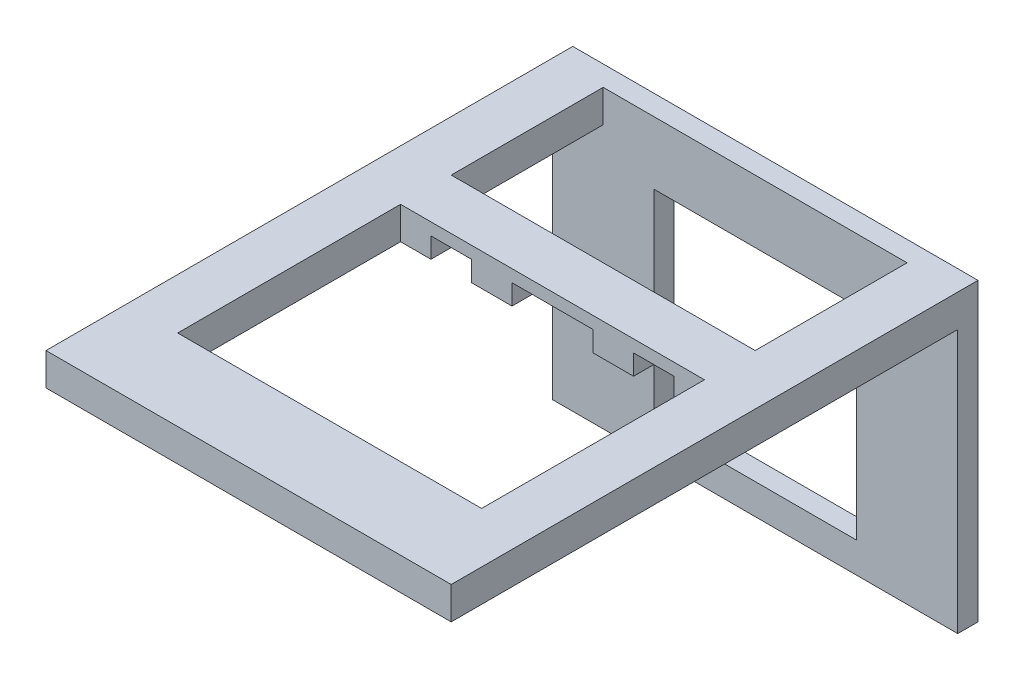
ISO-10303-21;
HEADER;
FILE_DESCRIPTION(('STEP AP214'),'2;1');
FILE_NAME('part.step','',(''),(''),'','','');
FILE_SCHEMA(('AUTOMOTIVE_DESIGN { 1 0 10303 214 1 1 1 1 }'));
ENDSEC;
DATA;
#1=APPLICATION_CONTEXT('core data for automotive mechanical design processes');
#2=APPLICATION_PROTOCOL_DEFINITION('international standard','automotive_design',2000,#1);
#3=PRODUCT_CONTEXT('',#1,'mechanical');
#4=PRODUCT('Part','Part','',(#3));
#5=PRODUCT_RELATED_PRODUCT_CATEGORY('part','',(#4));
#6=PRODUCT_DEFINITION_FORMATION('','',#4);
#7=PRODUCT_DEFINITION_CONTEXT('part definition',#1,'design');
#8=PRODUCT_DEFINITION('design','',#6,#7);
#9=PRODUCT_DEFINITION_SHAPE('','',#8);
#10=(LENGTH_UNIT() NAMED_UNIT(*) SI_UNIT(.MILLI.,.METRE.));
#11=(NAMED_UNIT(*) PLANE_ANGLE_UNIT() SI_UNIT($,.RADIAN.));
#12=(NAMED_UNIT(*) SI_UNIT($,.STERADIAN.) SOLID_ANGLE_UNIT());
#13=UNCERTAINTY_MEASURE_WITH_UNIT(LENGTH_MEASURE(1.E-05),#10,'distance_accuracy_value','');
#14=(GEOMETRIC_REPRESENTATION_CONTEXT(3) GLOBAL_UNCERTAINTY_ASSIGNED_CONTEXT((#13)) GLOBAL_UNIT_ASSIGNED_CONTEXT((#10,
#11,#12)) REPRESENTATION_CONTEXT('',''));
#15=CARTESIAN_POINT('',(0.,0.,0.));
#16=DIRECTION('',(0.,0.,1.));
#17=DIRECTION('',(1.,0.,0.));
#18=AXIS2_PLACEMENT_3D('',#15,#16,#17);
#19=CARTESIAN_POINT('',(0.,10.702908894462,11.));
#20=DIRECTION('',(0.,0.,1.));
#21=DIRECTION('',(1.,0.,0.));
#22=AXIS2_PLACEMENT_3D('',#19,#20,#21);
#23=PLANE('',#22);
#24=DIRECTION('',(-1.,0.,0.));
#25=VECTOR('',#24,1.);
#26=CARTESIAN_POINT('',(-6.,10.102908894462,11.));
#27=LINE('',#26,#25);
#28=CARTESIAN_POINT('',(-4.,10.102908894462,11.));
#29=VERTEX_POINT('',#28);
#30=CARTESIAN_POINT('',(-6.,10.102908894462,11.));
#31=VERTEX_POINT('',#30);
#32=EDGE_CURVE('E400',#29,#31,#27,.T.);
#33=ORIENTED_EDGE('',*,*,#32,.F.);
#34=DIRECTION('',(0.,1.,0.));
#35=VECTOR('',#34,1.);
#36=CARTESIAN_POINT('',(-4.,10.102908894462,11.));
#37=LINE('',#36,#35);
#38=CARTESIAN_POINT('',(-4.,9.10290889446199,11.));
#39=VERTEX_POINT('',#38);
#40=EDGE_CURVE('E819',#39,#29,#37,.T.);
#41=ORIENTED_EDGE('',*,*,#40,.F.);
#42=DIRECTION('',(-1.,0.,0.));
#43=VECTOR('',#42,1.);
#44=CARTESIAN_POINT('',(0.,9.10290889446198,11.));
#45=LINE('',#44,#43);
#46=CARTESIAN_POINT('',(-2.,9.10290889446198,11.));
#47=VERTEX_POINT('',#46);
#48=EDGE_CURVE('E256',#47,#39,#45,.T.);
#49=ORIENTED_EDGE('',*,*,#48,.F.);
#50=DIRECTION('',(0.,-1.,0.));
#51=VECTOR('',#50,1.);
#52=CARTESIAN_POINT('',(-2.,10.102908894462,11.));
#53=LINE('',#52,#51);
#54=CARTESIAN_POINT('',(-2.,10.102908894462,11.));
#55=VERTEX_POINT('',#54);
#56=EDGE_CURVE('E64',#55,#47,#53,.T.);
#57=ORIENTED_EDGE('',*,*,#56,.F.);
#58=DIRECTION('',(-1.,0.,0.));
#59=VECTOR('',#58,1.);
#60=CARTESIAN_POINT('',(-2.,10.102908894462,11.));
#61=LINE('',#60,#59);
#62=CARTESIAN_POINT('',(2.,10.102908894462,11.));
#63=VERTEX_POINT('',#62);
#64=EDGE_CURVE('E417',#63,#55,#61,.T.);
#65=ORIENTED_EDGE('',*,*,#64,.F.);
#66=DIRECTION('',(0.,1.,0.));
#67=VECTOR('',#66,1.);
#68=CARTESIAN_POINT('',(2.,10.102908894462,11.));
#69=LINE('',#68,#67);
#70=CARTESIAN_POINT('',(2.,9.10290889446199,11.));
#71=VERTEX_POINT('',#70);
#72=EDGE_CURVE('E445',#71,#63,#69,.T.);
#73=ORIENTED_EDGE('',*,*,#72,.F.);
#74=CARTESIAN_POINT('',(4.,9.10290889446198,11.));
#75=VERTEX_POINT('',#74);
#76=EDGE_CURVE('E281',#75,#71,#45,.T.);
#77=ORIENTED_EDGE('',*,*,#76,.F.);
#78=DIRECTION('',(0.,-1.,0.));
#79=VECTOR('',#78,1.);
#80=CARTESIAN_POINT('',(4.,10.102908894462,11.));
#81=LINE('',#80,#79);
#82=CARTESIAN_POINT('',(4.,10.102908894462,11.));
#83=VERTEX_POINT('',#82);
#84=EDGE_CURVE('E423',#83,#75,#81,.T.);
#85=ORIENTED_EDGE('',*,*,#84,.F.);
#86=DIRECTION('',(-1.,0.,0.));
#87=VECTOR('',#86,1.);
#88=CARTESIAN_POINT('',(4.,10.102908894462,11.));
#89=LINE('',#88,#87);
#90=CARTESIAN_POINT('',(6.,10.102908894462,11.));
#91=VERTEX_POINT('',#90);
#92=EDGE_CURVE('E248',#91,#83,#89,.T.);
#93=ORIENTED_EDGE('',*,*,#92,.F.);
#94=DIRECTION('',(0.,1.,0.));
#95=VECTOR('',#94,1.);
#96=CARTESIAN_POINT('',(6.,10.102908894462,11.));
#97=LINE('',#96,#95);
#98=CARTESIAN_POINT('',(6.,9.10290889446199,11.));
#99=VERTEX_POINT('',#98);
#100=EDGE_CURVE('E420',#99,#91,#97,.T.);
#101=ORIENTED_EDGE('',*,*,#100,.F.);
#102=CARTESIAN_POINT('',(7.5,9.10290889446199,11.));
#103=VERTEX_POINT('',#102);
#104=EDGE_CURVE('E277',#103,#99,#45,.T.);
#105=ORIENTED_EDGE('',*,*,#104,.F.);
#106=DIRECTION('',(0.,-1.,0.));
#107=VECTOR('',#106,1.);
#108=CARTESIAN_POINT('',(7.5,10.702908894462,11.));
#109=LINE('',#108,#107);
#110=CARTESIAN_POINT('',(7.5,10.702908894462,11.));
#111=VERTEX_POINT('',#110);
#112=EDGE_CURVE('E309',#111,#103,#109,.T.);
#113=ORIENTED_EDGE('',*,*,#112,.F.);
#114=DIRECTION('',(-1.,0.,0.));
#115=VECTOR('',#114,1.);
#116=CARTESIAN_POINT('',(0.,10.702908894462,11.));
#117=LINE('',#116,#115);
#118=CARTESIAN_POINT('',(-7.5,10.702908894462,11.));
#119=VERTEX_POINT('',#118);
#120=EDGE_CURVE('E475',#111,#119,#117,.T.);
#121=ORIENTED_EDGE('',*,*,#120,.T.);
#122=DIRECTION('',(0.,-1.,0.));
#123=VECTOR('',#122,1.);
#124=CARTESIAN_POINT('',(-7.5,10.702908894462,11.));
#125=LINE('',#124,#123);
#126=CARTESIAN_POINT('',(-7.5,9.10290889446198,11.));
#127=VERTEX_POINT('',#126);
#128=EDGE_CURVE('E299',#119,#127,#125,.T.);
#129=ORIENTED_EDGE('',*,*,#128,.T.);
#130=CARTESIAN_POINT('',(-6.,9.10290889446198,11.));
#131=VERTEX_POINT('',#130);
#132=EDGE_CURVE('E276',#131,#127,#45,.T.);
#133=ORIENTED_EDGE('',*,*,#132,.F.);
#134=DIRECTION('',(0.,-1.,0.));
#135=VECTOR('',#134,1.);
#136=CARTESIAN_POINT('',(-6.,10.102908894462,11.));
#137=LINE('',#136,#135);
#138=EDGE_CURVE('E56',#31,#131,#137,.T.);
#139=ORIENTED_EDGE('',*,*,#138,.F.);
#140=EDGE_LOOP('',(#33,#41,#49,#57,#65,#73,#77,#85,#93,#101,#105,#113,#121,#129,#133,#139));
#141=FACE_BOUND('',#140,.T.);
#142=ADVANCED_FACE('F39',(#141),#23,.T.);
#143=CARTESIAN_POINT('',(0.,10.702908894462,8.5));
#144=DIRECTION('',(0.,0.,1.));
#145=DIRECTION('',(1.,0.,0.));
#146=AXIS2_PLACEMENT_3D('',#143,#144,#145);
#147=PLANE('',#146);
#148=DIRECTION('',(0.,1.,0.));
#149=VECTOR('',#148,1.);
#150=CARTESIAN_POINT('',(-4.,10.102908894462,8.5));
#151=LINE('',#150,#149);
#152=CARTESIAN_POINT('',(-4.,9.10290889446198,8.5));
#153=VERTEX_POINT('',#152);
#154=CARTESIAN_POINT('',(-4.,10.102908894462,8.5));
#155=VERTEX_POINT('',#154);
#156=EDGE_CURVE('E237',#153,#155,#151,.T.);
#157=ORIENTED_EDGE('',*,*,#156,.T.);
#158=DIRECTION('',(-1.,0.,0.));
#159=VECTOR('',#158,1.);
#160=CARTESIAN_POINT('',(-6.,10.102908894462,8.5));
#161=LINE('',#160,#159);
#162=CARTESIAN_POINT('',(-6.,10.102908894462,8.5));
#163=VERTEX_POINT('',#162);
#164=EDGE_CURVE('E405',#155,#163,#161,.T.);
#165=ORIENTED_EDGE('',*,*,#164,.T.);
#166=DIRECTION('',(0.,-1.,0.));
#167=VECTOR('',#166,1.);
#168=CARTESIAN_POINT('',(-6.,10.102908894462,8.5));
#169=LINE('',#168,#167);
#170=CARTESIAN_POINT('',(-6.,9.10290889446198,8.5));
#171=VERTEX_POINT('',#170);
#172=EDGE_CURVE('E247',#163,#171,#169,.T.);
#173=ORIENTED_EDGE('',*,*,#172,.T.);
#174=DIRECTION('',(-1.,0.,0.));
#175=VECTOR('',#174,1.);
#176=CARTESIAN_POINT('',(0.,9.10290889446198,8.5));
#177=LINE('',#176,#175);
#178=CARTESIAN_POINT('',(-7.5,9.10290889446198,8.5));
#179=VERTEX_POINT('',#178);
#180=EDGE_CURVE('E264',#171,#179,#177,.T.);
#181=ORIENTED_EDGE('',*,*,#180,.T.);
#182=DIRECTION('',(0.,-1.,0.));
#183=VECTOR('',#182,1.);
#184=CARTESIAN_POINT('',(-7.5,10.702908894462,8.5));
#185=LINE('',#184,#183);
#186=CARTESIAN_POINT('',(-7.5,10.702908894462,8.5));
#187=VERTEX_POINT('',#186);
#188=EDGE_CURVE('E313',#187,#179,#185,.T.);
#189=ORIENTED_EDGE('',*,*,#188,.F.);
#190=DIRECTION('',(-1.,0.,0.));
#191=VECTOR('',#190,1.);
#192=CARTESIAN_POINT('',(0.,10.702908894462,8.5));
#193=LINE('',#192,#191);
#194=CARTESIAN_POINT('',(7.5,10.702908894462,8.5));
#195=VERTEX_POINT('',#194);
#196=EDGE_CURVE('E470',#195,#187,#193,.T.);
#197=ORIENTED_EDGE('',*,*,#196,.F.);
#198=DIRECTION('',(0.,-1.,0.));
#199=VECTOR('',#198,1.);
#200=CARTESIAN_POINT('',(7.5,10.702908894462,8.5));
#201=LINE('',#200,#199);
#202=CARTESIAN_POINT('',(7.5,9.10290889446199,8.5));
#203=VERTEX_POINT('',#202);
#204=EDGE_CURVE('E316',#195,#203,#201,.T.);
#205=ORIENTED_EDGE('',*,*,#204,.T.);
#206=CARTESIAN_POINT('',(6.,9.10290889446199,8.5));
#207=VERTEX_POINT('',#206);
#208=EDGE_CURVE('E267',#203,#207,#177,.T.);
#209=ORIENTED_EDGE('',*,*,#208,.T.);
#210=DIRECTION('',(0.,1.,0.));
#211=VECTOR('',#210,1.);
#212=CARTESIAN_POINT('',(6.,10.102908894462,8.5));
#213=LINE('',#212,#211);
#214=CARTESIAN_POINT('',(6.,10.102908894462,8.5));
#215=VERTEX_POINT('',#214);
#216=EDGE_CURVE('E413',#207,#215,#213,.T.);
#217=ORIENTED_EDGE('',*,*,#216,.T.);
#218=DIRECTION('',(-1.,0.,0.));
#219=VECTOR('',#218,1.);
#220=CARTESIAN_POINT('',(4.,10.102908894462,8.5));
#221=LINE('',#220,#219);
#222=CARTESIAN_POINT('',(4.,10.102908894462,8.5));
#223=VERTEX_POINT('',#222);
#224=EDGE_CURVE('E436',#215,#223,#221,.T.);
#225=ORIENTED_EDGE('',*,*,#224,.T.);
#226=DIRECTION('',(0.,-1.,0.));
#227=VECTOR('',#226,1.);
#228=CARTESIAN_POINT('',(4.,10.102908894462,8.5));
#229=LINE('',#228,#227);
#230=CARTESIAN_POINT('',(4.,9.10290889446198,8.5));
#231=VERTEX_POINT('',#230);
#232=EDGE_CURVE('E416',#223,#231,#229,.T.);
#233=ORIENTED_EDGE('',*,*,#232,.T.);
#234=CARTESIAN_POINT('',(2.,9.10290889446198,8.5));
#235=VERTEX_POINT('',#234);
#236=EDGE_CURVE('E263',#231,#235,#177,.T.);
#237=ORIENTED_EDGE('',*,*,#236,.T.);
#238=DIRECTION('',(0.,1.,0.));
#239=VECTOR('',#238,1.);
#240=CARTESIAN_POINT('',(2.,10.102908894462,8.5));
#241=LINE('',#240,#239);
#242=CARTESIAN_POINT('',(2.,10.102908894462,8.5));
#243=VERTEX_POINT('',#242);
#244=EDGE_CURVE('E441',#235,#243,#241,.T.);
#245=ORIENTED_EDGE('',*,*,#244,.T.);
#246=DIRECTION('',(-1.,0.,0.));
#247=VECTOR('',#246,1.);
#248=CARTESIAN_POINT('',(-2.,10.102908894462,8.5));
#249=LINE('',#248,#247);
#250=CARTESIAN_POINT('',(-2.,10.102908894462,8.5));
#251=VERTEX_POINT('',#250);
#252=EDGE_CURVE('E460',#243,#251,#249,.T.);
#253=ORIENTED_EDGE('',*,*,#252,.T.);
#254=DIRECTION('',(0.,-1.,0.));
#255=VECTOR('',#254,1.);
#256=CARTESIAN_POINT('',(-2.,10.102908894462,8.5));
#257=LINE('',#256,#255);
#258=CARTESIAN_POINT('',(-2.,9.10290889446198,8.5));
#259=VERTEX_POINT('',#258);
#260=EDGE_CURVE('E262',#251,#259,#257,.T.);
#261=ORIENTED_EDGE('',*,*,#260,.T.);
#262=EDGE_CURVE('E254',#259,#153,#177,.T.);
#263=ORIENTED_EDGE('',*,*,#262,.T.);
#264=EDGE_LOOP('',(#157,#165,#173,#181,#189,#197,#205,#209,#217,#225,#233,#237,#245,#253,#261,#263));
#265=FACE_BOUND('',#264,.T.);
#266=ADVANCED_FACE('F260',(#265),#147,.F.);
#267=CARTESIAN_POINT('',(0.,9.10290889446198,0.));
#268=DIRECTION('',(0.,1.,0.));
#269=DIRECTION('',(-1.,0.,0.));
#270=AXIS2_PLACEMENT_3D('',#267,#268,#269);
#271=PLANE('',#270);
#272=DIRECTION('',(0.,0.,-1.));
#273=VECTOR('',#272,1.);
#274=CARTESIAN_POINT('',(-4.,9.10290889446199,26.001));
#275=LINE('',#274,#273);
#276=EDGE_CURVE('E241',#39,#153,#275,.T.);
#277=ORIENTED_EDGE('',*,*,#276,.T.);
#278=ORIENTED_EDGE('',*,*,#262,.F.);
#279=DIRECTION('',(0.,0.,-1.));
#280=VECTOR('',#279,1.);
#281=CARTESIAN_POINT('',(-2.,9.10290889446199,26.001));
#282=LINE('',#281,#280);
#283=EDGE_CURVE('E458',#47,#259,#282,.T.);
#284=ORIENTED_EDGE('',*,*,#283,.F.);
#285=ORIENTED_EDGE('',*,*,#48,.T.);
#286=EDGE_LOOP('',(#277,#278,#284,#285));
#287=FACE_BOUND('',#286,.T.);
#288=ADVANCED_FACE('F253',(#287),#271,.F.);
#289=DIRECTION('',(0.,0.,-1.));
#290=VECTOR('',#289,1.);
#291=CARTESIAN_POINT('',(-6.,9.10290889446199,26.001));
#292=LINE('',#291,#290);
#293=EDGE_CURVE('E257',#131,#171,#292,.T.);
#294=ORIENTED_EDGE('',*,*,#293,.F.);
#295=ORIENTED_EDGE('',*,*,#132,.T.);
#296=DIRECTION('',(0.,0.,1.));
#297=VECTOR('',#296,1.);
#298=CARTESIAN_POINT('',(-7.50000000000001,9.10290889446198,0.));
#299=LINE('',#298,#297);
#300=CARTESIAN_POINT('',(-7.5,9.10290889446198,22.));
#301=VERTEX_POINT('',#300);
#302=EDGE_CURVE('E272',#127,#301,#299,.T.);
#303=ORIENTED_EDGE('',*,*,#302,.T.);
#304=DIRECTION('',(-1.,0.,0.));
#305=VECTOR('',#304,1.);
#306=CARTESIAN_POINT('',(0.,9.10290889446198,22.));
#307=LINE('',#306,#305);
#308=CARTESIAN_POINT('',(7.5,9.10290889446199,22.));
#309=VERTEX_POINT('',#308);
#310=EDGE_CURVE('E284',#309,#301,#307,.T.);
#311=ORIENTED_EDGE('',*,*,#310,.F.);
#312=DIRECTION('',(0.,0.,1.));
#313=VECTOR('',#312,1.);
#314=CARTESIAN_POINT('',(7.5,9.10290889446199,0.));
#315=LINE('',#314,#313);
#316=EDGE_CURVE('E280',#103,#309,#315,.T.);
#317=ORIENTED_EDGE('',*,*,#316,.F.);
#318=ORIENTED_EDGE('',*,*,#104,.T.);
#319=DIRECTION('',(0.,0.,-1.));
#320=VECTOR('',#319,1.);
#321=CARTESIAN_POINT('',(6.,9.10290889446199,26.001));
#322=LINE('',#321,#320);
#323=EDGE_CURVE('E431',#99,#207,#322,.T.);
#324=ORIENTED_EDGE('',*,*,#323,.T.);
#325=ORIENTED_EDGE('',*,*,#208,.F.);
#326=DIRECTION('',(0.,0.,1.));
#327=VECTOR('',#326,1.);
#328=CARTESIAN_POINT('',(7.5,9.10290889446199,0.));
#329=LINE('',#328,#327);
#330=CARTESIAN_POINT('',(7.5,9.10290889446199,1.));
#331=VERTEX_POINT('',#330);
#332=EDGE_CURVE('E268',#331,#203,#329,.T.);
#333=ORIENTED_EDGE('',*,*,#332,.F.);
#334=DIRECTION('',(-1.,0.,0.));
#335=VECTOR('',#334,1.);
#336=CARTESIAN_POINT('',(0.,9.10290889446198,1.));
#337=LINE('',#336,#335);
#338=CARTESIAN_POINT('',(10.,9.10290889446199,1.));
#339=VERTEX_POINT('',#338);
#340=EDGE_CURVE('E329',#339,#331,#337,.T.);
#341=ORIENTED_EDGE('',*,*,#340,.F.);
#342=DIRECTION('',(0.,0.,-1.));
#343=VECTOR('',#342,1.);
#344=CARTESIAN_POINT('',(10.,9.10290889446199,0.));
#345=LINE('',#344,#343);
#346=CARTESIAN_POINT('',(10.,9.10290889446199,26.));
#347=VERTEX_POINT('',#346);
#348=EDGE_CURVE('E292',#347,#339,#345,.T.);
#349=ORIENTED_EDGE('',*,*,#348,.F.);
#350=DIRECTION('',(-1.,0.,0.));
#351=VECTOR('',#350,1.);
#352=CARTESIAN_POINT('',(0.,9.10290889446198,26.));
#353=LINE('',#352,#351);
#354=CARTESIAN_POINT('',(-10.,9.10290889446198,26.));
#355=VERTEX_POINT('',#354);
#356=EDGE_CURVE('E289',#347,#355,#353,.T.);
#357=ORIENTED_EDGE('',*,*,#356,.T.);
#358=DIRECTION('',(0.,0.,1.));
#359=VECTOR('',#358,1.);
#360=CARTESIAN_POINT('',(-10.,9.10290889446198,0.));
#361=LINE('',#360,#359);
#362=CARTESIAN_POINT('',(-10.,9.10290889446198,1.));
#363=VERTEX_POINT('',#362);
#364=EDGE_CURVE('E287',#363,#355,#361,.T.);
#365=ORIENTED_EDGE('',*,*,#364,.F.);
#366=CARTESIAN_POINT('',(-7.50000000000001,9.10290889446198,1.));
#367=VERTEX_POINT('',#366);
#368=EDGE_CURVE('E327',#367,#363,#337,.T.);
#369=ORIENTED_EDGE('',*,*,#368,.F.);
#370=DIRECTION('',(0.,0.,1.));
#371=VECTOR('',#370,1.);
#372=CARTESIAN_POINT('',(-7.50000000000001,9.10290889446198,0.));
#373=LINE('',#372,#371);
#374=EDGE_CURVE('E398',#367,#179,#373,.T.);
#375=ORIENTED_EDGE('',*,*,#374,.T.);
#376=ORIENTED_EDGE('',*,*,#180,.F.);
#377=EDGE_LOOP('',(#294,#295,#303,#311,#317,#318,#324,#325,#333,#341,#349,#357,#365,#369,#375,#376));
#378=FACE_BOUND('',#377,.T.);
#379=ADVANCED_FACE('F488',(#378),#271,.F.);
#380=DIRECTION('',(0.,0.,-1.));
#381=VECTOR('',#380,1.);
#382=CARTESIAN_POINT('',(4.,9.10290889446199,26.001));
#383=LINE('',#382,#381);
#384=EDGE_CURVE('E434',#75,#231,#383,.T.);
#385=ORIENTED_EDGE('',*,*,#384,.F.);
#386=ORIENTED_EDGE('',*,*,#76,.T.);
#387=DIRECTION('',(0.,0.,-1.));
#388=VECTOR('',#387,1.);
#389=CARTESIAN_POINT('',(2.,9.10290889446199,26.001));
#390=LINE('',#389,#388);
#391=EDGE_CURVE('E455',#71,#235,#390,.T.);
#392=ORIENTED_EDGE('',*,*,#391,.T.);
#393=ORIENTED_EDGE('',*,*,#236,.F.);
#394=EDGE_LOOP('',(#385,#386,#392,#393));
#395=FACE_BOUND('',#394,.T.);
#396=ADVANCED_FACE('F511',(#395),#271,.F.);
#397=CARTESIAN_POINT('',(0.,7.60290889446198,1.));
#398=DIRECTION('',(0.,1.,0.));
#399=DIRECTION('',(0.,0.,1.));
#400=AXIS2_PLACEMENT_3D('',#397,#398,#399);
#401=PLANE('',#400);
#402=DIRECTION('',(1.,0.,0.));
#403=VECTOR('',#402,1.);
#404=CARTESIAN_POINT('',(0.,7.60290889446198,0.));
#405=LINE('',#404,#403);
#406=CARTESIAN_POINT('',(-5.,7.60290889446198,0.));
#407=VERTEX_POINT('',#406);
#408=CARTESIAN_POINT('',(5.,7.60290889446198,0.));
#409=VERTEX_POINT('',#408);
#410=EDGE_CURVE('E355',#407,#409,#405,.T.);
#411=ORIENTED_EDGE('',*,*,#410,.T.);
#412=DIRECTION('',(0.,0.,-1.));
#413=VECTOR('',#412,1.);
#414=CARTESIAN_POINT('',(5.,7.60290889446198,1.));
#415=LINE('',#414,#413);
#416=CARTESIAN_POINT('',(5.,7.60290889446198,1.));
#417=VERTEX_POINT('',#416);
#418=EDGE_CURVE('E11',#417,#409,#415,.T.);
#419=ORIENTED_EDGE('',*,*,#418,.F.);
#420=DIRECTION('',(1.,0.,0.));
#421=VECTOR('',#420,1.);
#422=CARTESIAN_POINT('',(0.,7.60290889446198,1.));
#423=LINE('',#422,#421);
#424=CARTESIAN_POINT('',(-5.,7.60290889446198,1.));
#425=VERTEX_POINT('',#424);
#426=EDGE_CURVE('E337',#425,#417,#423,.T.);
#427=ORIENTED_EDGE('',*,*,#426,.F.);
#428=DIRECTION('',(0.,0.,-1.));
#429=VECTOR('',#428,1.);
#430=CARTESIAN_POINT('',(-5.,7.60290889446198,1.));
#431=LINE('',#430,#429);
#432=EDGE_CURVE('E364',#425,#407,#431,.T.);
#433=ORIENTED_EDGE('',*,*,#432,.T.);
#434=EDGE_LOOP('',(#411,#419,#427,#433));
#435=FACE_BOUND('',#434,.T.);
#436=ADVANCED_FACE('F579',(#435),#401,.F.);
#437=CARTESIAN_POINT('',(5.,0.,1.));
#438=DIRECTION('',(-1.,0.,0.));
#439=DIRECTION('',(0.,0.,1.));
#440=AXIS2_PLACEMENT_3D('',#437,#438,#439);
#441=PLANE('',#440);
#442=DIRECTION('',(0.,1.,0.));
#443=VECTOR('',#442,1.);
#444=CARTESIAN_POINT('',(5.,0.,0.));
#445=LINE('',#444,#443);
#446=CARTESIAN_POINT('',(5.,-2.39709110553801,0.));
#447=VERTEX_POINT('',#446);
#448=EDGE_CURVE('E358',#447,#409,#445,.T.);
#449=ORIENTED_EDGE('',*,*,#448,.F.);
#450=DIRECTION('',(0.,0.,-1.));
#451=VECTOR('',#450,1.);
#452=CARTESIAN_POINT('',(5.,-2.39709110553801,1.));
#453=LINE('',#452,#451);
#454=CARTESIAN_POINT('',(5.,-2.39709110553801,1.));
#455=VERTEX_POINT('',#454);
#456=EDGE_CURVE('E48',#455,#447,#453,.T.);
#457=ORIENTED_EDGE('',*,*,#456,.F.);
#458=DIRECTION('',(0.,1.,0.));
#459=VECTOR('',#458,1.);
#460=CARTESIAN_POINT('',(5.,0.,1.));
#461=LINE('',#460,#459);
#462=EDGE_CURVE('E339',#455,#417,#461,.T.);
#463=ORIENTED_EDGE('',*,*,#462,.T.);
#464=ORIENTED_EDGE('',*,*,#418,.T.);
#465=EDGE_LOOP('',(#449,#457,#463,#464));
#466=FACE_BOUND('',#465,.T.);
#467=ADVANCED_FACE('F575',(#466),#441,.T.);
#468=CARTESIAN_POINT('',(0.,-2.39709110553801,1.));
#469=DIRECTION('',(0.,-1.,0.));
#470=DIRECTION('',(1.,0.,0.));
#471=AXIS2_PLACEMENT_3D('',#468,#469,#470);
#472=PLANE('',#471);
#473=DIRECTION('',(-1.,0.,0.));
#474=VECTOR('',#473,1.);
#475=CARTESIAN_POINT('',(0.,-2.39709110553801,0.));
#476=LINE('',#475,#474);
#477=CARTESIAN_POINT('',(-5.,-2.39709110553802,0.));
#478=VERTEX_POINT('',#477);
#479=EDGE_CURVE('E361',#447,#478,#476,.T.);
#480=ORIENTED_EDGE('',*,*,#479,.T.);
#481=DIRECTION('',(0.,0.,-1.));
#482=VECTOR('',#481,1.);
#483=CARTESIAN_POINT('',(-5.,-2.39709110553802,1.));
#484=LINE('',#483,#482);
#485=CARTESIAN_POINT('',(-5.,-2.39709110553802,1.));
#486=VERTEX_POINT('',#485);
#487=EDGE_CURVE('E367',#486,#478,#484,.T.);
#488=ORIENTED_EDGE('',*,*,#487,.F.);
#489=DIRECTION('',(-1.,0.,0.));
#490=VECTOR('',#489,1.);
#491=CARTESIAN_POINT('',(0.,-2.39709110553801,1.));
#492=LINE('',#491,#490);
#493=EDGE_CURVE('E342',#455,#486,#492,.T.);
#494=ORIENTED_EDGE('',*,*,#493,.F.);
#495=ORIENTED_EDGE('',*,*,#456,.T.);
#496=EDGE_LOOP('',(#480,#488,#494,#495));
#497=FACE_BOUND('',#496,.T.);
#498=ADVANCED_FACE('F572',(#497),#472,.F.);
#499=CARTESIAN_POINT('',(10.,0.,1.));
#500=DIRECTION('',(1.,0.,0.));
#501=DIRECTION('',(0.,1.,0.));
#502=AXIS2_PLACEMENT_3D('',#499,#500,#501);
#503=PLANE('',#502);
#504=DIRECTION('',(0.,-1.,0.));
#505=VECTOR('',#504,1.);
#506=CARTESIAN_POINT('',(10.,0.,0.));
#507=LINE('',#506,#505);
#508=CARTESIAN_POINT('',(10.,10.702908894462,0.));
#509=VERTEX_POINT('',#508);
#510=CARTESIAN_POINT('',(10.,-3.89709110553801,0.));
#511=VERTEX_POINT('',#510);
#512=EDGE_CURVE('E302',#509,#511,#507,.T.);
#513=ORIENTED_EDGE('',*,*,#512,.F.);
#514=DIRECTION('',(0.,0.,-1.));
#515=VECTOR('',#514,1.);
#516=CARTESIAN_POINT('',(10.,10.702908894462,0.));
#517=LINE('',#516,#515);
#518=CARTESIAN_POINT('',(10.,10.702908894462,26.));
#519=VERTEX_POINT('',#518);
#520=EDGE_CURVE('E317',#519,#509,#517,.T.);
#521=ORIENTED_EDGE('',*,*,#520,.F.);
#522=DIRECTION('',(0.,-1.,0.));
#523=VECTOR('',#522,1.);
#524=CARTESIAN_POINT('',(10.,10.702908894462,26.));
#525=LINE('',#524,#523);
#526=EDGE_CURVE('E296',#519,#347,#525,.T.);
#527=ORIENTED_EDGE('',*,*,#526,.T.);
#528=ORIENTED_EDGE('',*,*,#348,.T.);
#529=DIRECTION('',(0.,-1.,0.));
#530=VECTOR('',#529,1.);
#531=CARTESIAN_POINT('',(10.,0.,1.));
#532=LINE('',#531,#530);
#533=CARTESIAN_POINT('',(10.,-3.89709110553801,1.));
#534=VERTEX_POINT('',#533);
#535=EDGE_CURVE('E324',#339,#534,#532,.T.);
#536=ORIENTED_EDGE('',*,*,#535,.T.);
#537=DIRECTION('',(0.,0.,-1.));
#538=VECTOR('',#537,1.);
#539=CARTESIAN_POINT('',(10.,-3.89709110553801,1.));
#540=LINE('',#539,#538);
#541=EDGE_CURVE('E346',#534,#511,#540,.T.);
#542=ORIENTED_EDGE('',*,*,#541,.T.);
#543=EDGE_LOOP('',(#513,#521,#527,#528,#536,#542));
#544=FACE_BOUND('',#543,.T.);
#545=ADVANCED_FACE('F41',(#544),#503,.T.);
#546=CARTESIAN_POINT('',(-10.,0.,1.));
#547=DIRECTION('',(1.,0.,0.));
#548=DIRECTION('',(0.,1.,0.));
#549=AXIS2_PLACEMENT_3D('',#546,#547,#548);
#550=PLANE('',#549);
#551=DIRECTION('',(0.,-1.,0.));
#552=VECTOR('',#551,1.);
#553=CARTESIAN_POINT('',(-10.,0.,0.));
#554=LINE('',#553,#552);
#555=CARTESIAN_POINT('',(-10.,10.702908894462,0.));
#556=VERTEX_POINT('',#555);
#557=CARTESIAN_POINT('',(-10.,-3.89709110553802,0.));
#558=VERTEX_POINT('',#557);
#559=EDGE_CURVE('E349',#556,#558,#554,.T.);
#560=ORIENTED_EDGE('',*,*,#559,.T.);
#561=DIRECTION('',(0.,0.,-1.));
#562=VECTOR('',#561,1.);
#563=CARTESIAN_POINT('',(-10.,-3.89709110553802,1.));
#564=LINE('',#563,#562);
#565=CARTESIAN_POINT('',(-10.,-3.89709110553802,1.));
#566=VERTEX_POINT('',#565);
#567=EDGE_CURVE('E43',#566,#558,#564,.T.);
#568=ORIENTED_EDGE('',*,*,#567,.F.);
#569=DIRECTION('',(0.,-1.,0.));
#570=VECTOR('',#569,1.);
#571=CARTESIAN_POINT('',(-10.,0.,1.));
#572=LINE('',#571,#570);
#573=EDGE_CURVE('E332',#363,#566,#572,.T.);
#574=ORIENTED_EDGE('',*,*,#573,.F.);
#575=ORIENTED_EDGE('',*,*,#364,.T.);
#576=DIRECTION('',(0.,-1.,0.));
#577=VECTOR('',#576,1.);
#578=CARTESIAN_POINT('',(-10.,10.702908894462,26.));
#579=LINE('',#578,#577);
#580=CARTESIAN_POINT('',(-10.,10.702908894462,26.));
#581=VERTEX_POINT('',#580);
#582=EDGE_CURVE('E298',#581,#355,#579,.T.);
#583=ORIENTED_EDGE('',*,*,#582,.F.);
#584=DIRECTION('',(0.,0.,1.));
#585=VECTOR('',#584,1.);
#586=CARTESIAN_POINT('',(-10.,10.702908894462,0.));
#587=LINE('',#586,#585);
#588=EDGE_CURVE('E381',#556,#581,#587,.T.);
#589=ORIENTED_EDGE('',*,*,#588,.F.);
#590=EDGE_LOOP('',(#560,#568,#574,#575,#583,#589));
#591=FACE_BOUND('',#590,.T.);
#592=ADVANCED_FACE('F379',(#591),#550,.F.);
#593=CARTESIAN_POINT('',(0.,-3.89709110553801,1.));
#594=DIRECTION('',(0.,-1.,0.));
#595=DIRECTION('',(1.,0.,0.));
#596=AXIS2_PLACEMENT_3D('',#593,#594,#595);
#597=PLANE('',#596);
#598=DIRECTION('',(-1.,0.,0.));
#599=VECTOR('',#598,1.);
#600=CARTESIAN_POINT('',(0.,-3.89709110553801,0.));
#601=LINE('',#600,#599);
#602=EDGE_CURVE('E352',#511,#558,#601,.T.);
#603=ORIENTED_EDGE('',*,*,#602,.F.);
#604=ORIENTED_EDGE('',*,*,#541,.F.);
#605=DIRECTION('',(-1.,0.,0.));
#606=VECTOR('',#605,1.);
#607=CARTESIAN_POINT('',(0.,-3.89709110553801,1.));
#608=LINE('',#607,#606);
#609=EDGE_CURVE('E334',#534,#566,#608,.T.);
#610=ORIENTED_EDGE('',*,*,#609,.T.);
#611=ORIENTED_EDGE('',*,*,#567,.T.);
#612=EDGE_LOOP('',(#603,#604,#610,#611));
#613=FACE_BOUND('',#612,.T.);
#614=ADVANCED_FACE('F374',(#613),#597,.T.);
#615=CARTESIAN_POINT('',(-5.,0.,1.));
#616=DIRECTION('',(-1.,0.,0.));
#617=DIRECTION('',(0.,-1.,0.));
#618=AXIS2_PLACEMENT_3D('',#615,#616,#617);
#619=PLANE('',#618);
#620=DIRECTION('',(0.,1.,0.));
#621=VECTOR('',#620,1.);
#622=CARTESIAN_POINT('',(-5.,0.,0.));
#623=LINE('',#622,#621);
#624=EDGE_CURVE('E328',#478,#407,#623,.T.);
#625=ORIENTED_EDGE('',*,*,#624,.T.);
#626=ORIENTED_EDGE('',*,*,#432,.F.);
#627=DIRECTION('',(0.,1.,0.));
#628=VECTOR('',#627,1.);
#629=CARTESIAN_POINT('',(-5.,0.,1.));
#630=LINE('',#629,#628);
#631=EDGE_CURVE('E344',#486,#425,#630,.T.);
#632=ORIENTED_EDGE('',*,*,#631,.F.);
#633=ORIENTED_EDGE('',*,*,#487,.T.);
#634=EDGE_LOOP('',(#625,#626,#632,#633));
#635=FACE_BOUND('',#634,.T.);
#636=ADVANCED_FACE('F566',(#635),#619,.F.);
#637=CARTESIAN_POINT('',(0.,0.,1.));
#638=DIRECTION('',(0.,0.,1.));
#639=DIRECTION('',(1.,0.,0.));
#640=AXIS2_PLACEMENT_3D('',#637,#638,#639);
#641=PLANE('',#640);
#642=ORIENTED_EDGE('',*,*,#535,.F.);
#643=ORIENTED_EDGE('',*,*,#340,.T.);
#644=DIRECTION('',(0.,-1.,0.));
#645=VECTOR('',#644,1.);
#646=CARTESIAN_POINT('',(7.5,10.702908894462,1.));
#647=LINE('',#646,#645);
#648=CARTESIAN_POINT('',(7.5,10.702908894462,1.));
#649=VERTEX_POINT('',#648);
#650=EDGE_CURVE('E320',#649,#331,#647,.T.);
#651=ORIENTED_EDGE('',*,*,#650,.F.);
#652=DIRECTION('',(1.,0.,0.));
#653=VECTOR('',#652,1.);
#654=CARTESIAN_POINT('',(0.,10.702908894462,1.));
#655=LINE('',#654,#653);
#656=CARTESIAN_POINT('',(-7.50000000000001,10.702908894462,1.));
#657=VERTEX_POINT('',#656);
#658=EDGE_CURVE('E466',#657,#649,#655,.T.);
#659=ORIENTED_EDGE('',*,*,#658,.F.);
#660=DIRECTION('',(0.,-1.,0.));
#661=VECTOR('',#660,1.);
#662=CARTESIAN_POINT('',(-7.50000000000001,10.702908894462,1.));
#663=LINE('',#662,#661);
#664=EDGE_CURVE('E306',#657,#367,#663,.T.);
#665=ORIENTED_EDGE('',*,*,#664,.T.);
#666=ORIENTED_EDGE('',*,*,#368,.T.);
#667=ORIENTED_EDGE('',*,*,#573,.T.);
#668=ORIENTED_EDGE('',*,*,#609,.F.);
#669=EDGE_LOOP('',(#642,#643,#651,#659,#665,#666,#667,#668));
#670=FACE_BOUND('',#669,.T.);
#671=ORIENTED_EDGE('',*,*,#426,.T.);
#672=ORIENTED_EDGE('',*,*,#462,.F.);
#673=ORIENTED_EDGE('',*,*,#493,.T.);
#674=ORIENTED_EDGE('',*,*,#631,.T.);
#675=EDGE_LOOP('',(#671,#672,#673,#674));
#676=FACE_BOUND('',#675,.T.);
#677=ADVANCED_FACE('F493',(#670,#676),#641,.T.);
#678=CARTESIAN_POINT('',(0.,0.,0.));
#679=DIRECTION('',(0.,0.,1.));
#680=DIRECTION('',(1.,0.,0.));
#681=AXIS2_PLACEMENT_3D('',#678,#679,#680);
#682=PLANE('',#681);
#683=ORIENTED_EDGE('',*,*,#512,.T.);
#684=ORIENTED_EDGE('',*,*,#602,.T.);
#685=ORIENTED_EDGE('',*,*,#559,.F.);
#686=DIRECTION('',(-1.,0.,0.));
#687=VECTOR('',#686,1.);
#688=CARTESIAN_POINT('',(0.,10.702908894462,0.));
#689=LINE('',#688,#687);
#690=EDGE_CURVE('E387',#509,#556,#689,.T.);
#691=ORIENTED_EDGE('',*,*,#690,.F.);
#692=EDGE_LOOP('',(#683,#684,#685,#691));
#693=FACE_BOUND('',#692,.T.);
#694=ORIENTED_EDGE('',*,*,#410,.F.);
#695=ORIENTED_EDGE('',*,*,#624,.F.);
#696=ORIENTED_EDGE('',*,*,#479,.F.);
#697=ORIENTED_EDGE('',*,*,#448,.T.);
#698=EDGE_LOOP('',(#694,#695,#696,#697));
#699=FACE_BOUND('',#698,.T.);
#700=ADVANCED_FACE('F385',(#693,#699),#682,.F.);
#701=CARTESIAN_POINT('',(0.,10.702908894462,26.));
#702=DIRECTION('',(0.,0.,1.));
#703=DIRECTION('',(1.,0.,0.));
#704=AXIS2_PLACEMENT_3D('',#701,#702,#703);
#705=PLANE('',#704);
#706=ORIENTED_EDGE('',*,*,#356,.F.);
#707=ORIENTED_EDGE('',*,*,#526,.F.);
#708=DIRECTION('',(-1.,0.,0.));
#709=VECTOR('',#708,1.);
#710=CARTESIAN_POINT('',(0.,10.702908894462,26.));
#711=LINE('',#710,#709);
#712=EDGE_CURVE('E394',#519,#581,#711,.T.);
#713=ORIENTED_EDGE('',*,*,#712,.T.);
#714=ORIENTED_EDGE('',*,*,#582,.T.);
#715=EDGE_LOOP('',(#706,#707,#713,#714));
#716=FACE_BOUND('',#715,.T.);
#717=ADVANCED_FACE('F485',(#716),#705,.T.);
#718=CARTESIAN_POINT('',(-7.50000000000001,10.702908894462,0.));
#719=DIRECTION('',(1.,0.,0.));
#720=DIRECTION('',(0.,1.,0.));
#721=AXIS2_PLACEMENT_3D('',#718,#719,#720);
#722=PLANE('',#721);
#723=ORIENTED_EDGE('',*,*,#302,.F.);
#724=ORIENTED_EDGE('',*,*,#128,.F.);
#725=DIRECTION('',(0.,0.,1.));
#726=VECTOR('',#725,1.);
#727=CARTESIAN_POINT('',(-7.50000000000001,10.702908894462,0.));
#728=LINE('',#727,#726);
#729=CARTESIAN_POINT('',(-7.5,10.702908894462,22.));
#730=VERTEX_POINT('',#729);
#731=EDGE_CURVE('E472',#119,#730,#728,.T.);
#732=ORIENTED_EDGE('',*,*,#731,.T.);
#733=DIRECTION('',(0.,-1.,0.));
#734=VECTOR('',#733,1.);
#735=CARTESIAN_POINT('',(-7.5,10.702908894462,22.));
#736=LINE('',#735,#734);
#737=EDGE_CURVE('E303',#730,#301,#736,.T.);
#738=ORIENTED_EDGE('',*,*,#737,.T.);
#739=EDGE_LOOP('',(#723,#724,#732,#738));
#740=FACE_BOUND('',#739,.T.);
#741=ADVANCED_FACE('F536',(#740),#722,.T.);
#742=CARTESIAN_POINT('',(7.5,10.702908894462,0.));
#743=DIRECTION('',(1.,0.,0.));
#744=DIRECTION('',(0.,1.,0.));
#745=AXIS2_PLACEMENT_3D('',#742,#743,#744);
#746=PLANE('',#745);
#747=ORIENTED_EDGE('',*,*,#316,.T.);
#748=DIRECTION('',(0.,-1.,0.));
#749=VECTOR('',#748,1.);
#750=CARTESIAN_POINT('',(7.5,10.702908894462,22.));
#751=LINE('',#750,#749);
#752=CARTESIAN_POINT('',(7.5,10.702908894462,22.));
#753=VERTEX_POINT('',#752);
#754=EDGE_CURVE('E305',#753,#309,#751,.T.);
#755=ORIENTED_EDGE('',*,*,#754,.F.);
#756=DIRECTION('',(0.,0.,1.));
#757=VECTOR('',#756,1.);
#758=CARTESIAN_POINT('',(7.5,10.702908894462,0.));
#759=LINE('',#758,#757);
#760=EDGE_CURVE('E478',#111,#753,#759,.T.);
#761=ORIENTED_EDGE('',*,*,#760,.F.);
#762=ORIENTED_EDGE('',*,*,#112,.T.);
#763=EDGE_LOOP('',(#747,#755,#761,#762));
#764=FACE_BOUND('',#763,.T.);
#765=ADVANCED_FACE('F529',(#764),#746,.F.);
#766=CARTESIAN_POINT('',(-7.50000000000001,10.702908894462,0.));
#767=DIRECTION('',(1.,0.,0.));
#768=DIRECTION('',(0.,1.,0.));
#769=AXIS2_PLACEMENT_3D('',#766,#767,#768);
#770=PLANE('',#769);
#771=ORIENTED_EDGE('',*,*,#374,.F.);
#772=ORIENTED_EDGE('',*,*,#664,.F.);
#773=DIRECTION('',(0.,0.,1.));
#774=VECTOR('',#773,1.);
#775=CARTESIAN_POINT('',(-7.50000000000001,10.702908894462,0.));
#776=LINE('',#775,#774);
#777=EDGE_CURVE('E295',#657,#187,#776,.T.);
#778=ORIENTED_EDGE('',*,*,#777,.T.);
#779=ORIENTED_EDGE('',*,*,#188,.T.);
#780=EDGE_LOOP('',(#771,#772,#778,#779));
#781=FACE_BOUND('',#780,.T.);
#782=ADVANCED_FACE('F500',(#781),#770,.T.);
#783=CARTESIAN_POINT('',(7.5,10.702908894462,0.));
#784=DIRECTION('',(1.,0.,0.));
#785=DIRECTION('',(0.,1.,0.));
#786=AXIS2_PLACEMENT_3D('',#783,#784,#785);
#787=PLANE('',#786);
#788=ORIENTED_EDGE('',*,*,#332,.T.);
#789=ORIENTED_EDGE('',*,*,#204,.F.);
#790=DIRECTION('',(0.,0.,1.));
#791=VECTOR('',#790,1.);
#792=CARTESIAN_POINT('',(7.5,10.702908894462,0.));
#793=LINE('',#792,#791);
#794=EDGE_CURVE('E468',#649,#195,#793,.T.);
#795=ORIENTED_EDGE('',*,*,#794,.F.);
#796=ORIENTED_EDGE('',*,*,#650,.T.);
#797=EDGE_LOOP('',(#788,#789,#795,#796));
#798=FACE_BOUND('',#797,.T.);
#799=ADVANCED_FACE('F540',(#798),#787,.F.);
#800=CARTESIAN_POINT('',(0.,10.702908894462,22.));
#801=DIRECTION('',(0.,0.,1.));
#802=DIRECTION('',(1.,0.,0.));
#803=AXIS2_PLACEMENT_3D('',#800,#801,#802);
#804=PLANE('',#803);
#805=ORIENTED_EDGE('',*,*,#310,.T.);
#806=ORIENTED_EDGE('',*,*,#737,.F.);
#807=DIRECTION('',(-1.,0.,0.));
#808=VECTOR('',#807,1.);
#809=CARTESIAN_POINT('',(0.,10.702908894462,22.));
#810=LINE('',#809,#808);
#811=EDGE_CURVE('E481',#753,#730,#810,.T.);
#812=ORIENTED_EDGE('',*,*,#811,.F.);
#813=ORIENTED_EDGE('',*,*,#754,.T.);
#814=EDGE_LOOP('',(#805,#806,#812,#813));
#815=FACE_BOUND('',#814,.T.);
#816=ADVANCED_FACE('F538',(#815),#804,.F.);
#817=CARTESIAN_POINT('',(0.,10.702908894462,0.));
#818=DIRECTION('',(0.,1.,0.));
#819=DIRECTION('',(-1.,0.,0.));
#820=AXIS2_PLACEMENT_3D('',#817,#818,#819);
#821=PLANE('',#820);
#822=ORIENTED_EDGE('',*,*,#777,.F.);
#823=ORIENTED_EDGE('',*,*,#658,.T.);
#824=ORIENTED_EDGE('',*,*,#794,.T.);
#825=ORIENTED_EDGE('',*,*,#196,.T.);
#826=EDGE_LOOP('',(#822,#823,#824,#825));
#827=FACE_BOUND('',#826,.T.);
#828=ORIENTED_EDGE('',*,*,#731,.F.);
#829=ORIENTED_EDGE('',*,*,#120,.F.);
#830=ORIENTED_EDGE('',*,*,#760,.T.);
#831=ORIENTED_EDGE('',*,*,#811,.T.);
#832=EDGE_LOOP('',(#828,#829,#830,#831));
#833=FACE_BOUND('',#832,.T.);
#834=ORIENTED_EDGE('',*,*,#690,.T.);
#835=ORIENTED_EDGE('',*,*,#588,.T.);
#836=ORIENTED_EDGE('',*,*,#712,.F.);
#837=ORIENTED_EDGE('',*,*,#520,.T.);
#838=EDGE_LOOP('',(#834,#835,#836,#837));
#839=FACE_BOUND('',#838,.T.);
#840=ADVANCED_FACE('F392',(#827,#833,#839),#821,.T.);
#841=CARTESIAN_POINT('',(-2.,10.102908894462,26.001));
#842=DIRECTION('',(0.,-1.,0.));
#843=DIRECTION('',(0.,0.,-1.));
#844=AXIS2_PLACEMENT_3D('',#841,#842,#843);
#845=PLANE('',#844);
#846=ORIENTED_EDGE('',*,*,#64,.T.);
#847=DIRECTION('',(0.,0.,-1.));
#848=VECTOR('',#847,1.);
#849=CARTESIAN_POINT('',(-2.,10.102908894462,26.001));
#850=LINE('',#849,#848);
#851=EDGE_CURVE('E449',#55,#251,#850,.T.);
#852=ORIENTED_EDGE('',*,*,#851,.T.);
#853=ORIENTED_EDGE('',*,*,#252,.F.);
#854=DIRECTION('',(0.,0.,-1.));
#855=VECTOR('',#854,1.);
#856=CARTESIAN_POINT('',(2.,10.102908894462,26.001));
#857=LINE('',#856,#855);
#858=EDGE_CURVE('E452',#63,#243,#857,.T.);
#859=ORIENTED_EDGE('',*,*,#858,.F.);
#860=EDGE_LOOP('',(#846,#852,#853,#859));
#861=FACE_BOUND('',#860,.T.);
#862=ADVANCED_FACE('F546',(#861),#845,.T.);
#863=CARTESIAN_POINT('',(2.,10.102908894462,26.001));
#864=DIRECTION('',(-1.,0.,0.));
#865=DIRECTION('',(0.,0.,1.));
#866=AXIS2_PLACEMENT_3D('',#863,#864,#865);
#867=PLANE('',#866);
#868=ORIENTED_EDGE('',*,*,#72,.T.);
#869=ORIENTED_EDGE('',*,*,#858,.T.);
#870=ORIENTED_EDGE('',*,*,#244,.F.);
#871=ORIENTED_EDGE('',*,*,#391,.F.);
#872=EDGE_LOOP('',(#868,#869,#870,#871));
#873=FACE_BOUND('',#872,.T.);
#874=ADVANCED_FACE('F518',(#873),#867,.T.);
#875=CARTESIAN_POINT('',(-2.,10.102908894462,26.001));
#876=DIRECTION('',(1.,0.,0.));
#877=DIRECTION('',(0.,0.,-1.));
#878=AXIS2_PLACEMENT_3D('',#875,#876,#877);
#879=PLANE('',#878);
#880=ORIENTED_EDGE('',*,*,#56,.T.);
#881=ORIENTED_EDGE('',*,*,#283,.T.);
#882=ORIENTED_EDGE('',*,*,#260,.F.);
#883=ORIENTED_EDGE('',*,*,#851,.F.);
#884=EDGE_LOOP('',(#880,#881,#882,#883));
#885=FACE_BOUND('',#884,.T.);
#886=ADVANCED_FACE('F746',(#885),#879,.T.);
#887=CARTESIAN_POINT('',(4.,10.102908894462,26.001));
#888=DIRECTION('',(0.,-1.,0.));
#889=DIRECTION('',(0.,0.,-1.));
#890=AXIS2_PLACEMENT_3D('',#887,#888,#889);
#891=PLANE('',#890);
#892=ORIENTED_EDGE('',*,*,#92,.T.);
#893=DIRECTION('',(0.,0.,-1.));
#894=VECTOR('',#893,1.);
#895=CARTESIAN_POINT('',(4.,10.102908894462,26.001));
#896=LINE('',#895,#894);
#897=EDGE_CURVE('E425',#83,#223,#896,.T.);
#898=ORIENTED_EDGE('',*,*,#897,.T.);
#899=ORIENTED_EDGE('',*,*,#224,.F.);
#900=DIRECTION('',(0.,0.,-1.));
#901=VECTOR('',#900,1.);
#902=CARTESIAN_POINT('',(6.,10.102908894462,26.001));
#903=LINE('',#902,#901);
#904=EDGE_CURVE('E428',#91,#215,#903,.T.);
#905=ORIENTED_EDGE('',*,*,#904,.F.);
#906=EDGE_LOOP('',(#892,#898,#899,#905));
#907=FACE_BOUND('',#906,.T.);
#908=ADVANCED_FACE('F522',(#907),#891,.T.);
#909=CARTESIAN_POINT('',(6.,10.102908894462,26.001));
#910=DIRECTION('',(-1.,0.,0.));
#911=DIRECTION('',(0.,-1.,0.));
#912=AXIS2_PLACEMENT_3D('',#909,#910,#911);
#913=PLANE('',#912);
#914=ORIENTED_EDGE('',*,*,#100,.T.);
#915=ORIENTED_EDGE('',*,*,#904,.T.);
#916=ORIENTED_EDGE('',*,*,#216,.F.);
#917=ORIENTED_EDGE('',*,*,#323,.F.);
#918=EDGE_LOOP('',(#914,#915,#916,#917));
#919=FACE_BOUND('',#918,.T.);
#920=ADVANCED_FACE('F756',(#919),#913,.T.);
#921=CARTESIAN_POINT('',(4.,10.102908894462,26.001));
#922=DIRECTION('',(1.,0.,0.));
#923=DIRECTION('',(0.,0.,-1.));
#924=AXIS2_PLACEMENT_3D('',#921,#922,#923);
#925=PLANE('',#924);
#926=ORIENTED_EDGE('',*,*,#84,.T.);
#927=ORIENTED_EDGE('',*,*,#384,.T.);
#928=ORIENTED_EDGE('',*,*,#232,.F.);
#929=ORIENTED_EDGE('',*,*,#897,.F.);
#930=EDGE_LOOP('',(#926,#927,#928,#929));
#931=FACE_BOUND('',#930,.T.);
#932=ADVANCED_FACE('F520',(#931),#925,.T.);
#933=CARTESIAN_POINT('',(-6.,10.102908894462,26.001));
#934=DIRECTION('',(0.,-1.,0.));
#935=DIRECTION('',(0.,0.,-1.));
#936=AXIS2_PLACEMENT_3D('',#933,#934,#935);
#937=PLANE('',#936);
#938=ORIENTED_EDGE('',*,*,#32,.T.);
#939=DIRECTION('',(0.,0.,-1.));
#940=VECTOR('',#939,1.);
#941=CARTESIAN_POINT('',(-6.,10.102908894462,26.001));
#942=LINE('',#941,#940);
#943=EDGE_CURVE('E821',#31,#163,#942,.T.);
#944=ORIENTED_EDGE('',*,*,#943,.T.);
#945=ORIENTED_EDGE('',*,*,#164,.F.);
#946=DIRECTION('',(0.,0.,-1.));
#947=VECTOR('',#946,1.);
#948=CARTESIAN_POINT('',(-4.,10.102908894462,26.001));
#949=LINE('',#948,#947);
#950=EDGE_CURVE('E243',#29,#155,#949,.T.);
#951=ORIENTED_EDGE('',*,*,#950,.F.);
#952=EDGE_LOOP('',(#938,#944,#945,#951));
#953=FACE_BOUND('',#952,.T.);
#954=ADVANCED_FACE('F755',(#953),#937,.T.);
#955=CARTESIAN_POINT('',(-4.,10.102908894462,26.001));
#956=DIRECTION('',(-1.,0.,0.));
#957=DIRECTION('',(0.,0.,1.));
#958=AXIS2_PLACEMENT_3D('',#955,#956,#957);
#959=PLANE('',#958);
#960=ORIENTED_EDGE('',*,*,#40,.T.);
#961=ORIENTED_EDGE('',*,*,#950,.T.);
#962=ORIENTED_EDGE('',*,*,#156,.F.);
#963=ORIENTED_EDGE('',*,*,#276,.F.);
#964=EDGE_LOOP('',(#960,#961,#962,#963));
#965=FACE_BOUND('',#964,.T.);
#966=ADVANCED_FACE('F240',(#965),#959,.T.);
#967=CARTESIAN_POINT('',(-6.,10.102908894462,26.001));
#968=DIRECTION('',(1.,0.,0.));
#969=DIRECTION('',(0.,1.,0.));
#970=AXIS2_PLACEMENT_3D('',#967,#968,#969);
#971=PLANE('',#970);
#972=ORIENTED_EDGE('',*,*,#138,.T.);
#973=ORIENTED_EDGE('',*,*,#293,.T.);
#974=ORIENTED_EDGE('',*,*,#172,.F.);
#975=ORIENTED_EDGE('',*,*,#943,.F.);
#976=EDGE_LOOP('',(#972,#973,#974,#975));
#977=FACE_BOUND('',#976,.T.);
#978=ADVANCED_FACE('F761',(#977),#971,.T.);
#979=CLOSED_SHELL('',(#142,#266,#288,#379,#396,#436,#467,#498,#545,#592,#614,#636,#677,#700,
#717,#741,#765,#782,#799,#816,#840,#862,#874,#886,#908,#920,#932,#954,#966,#978));
#980=MANIFOLD_SOLID_BREP('B2',#979);
#981=ADVANCED_BREP_SHAPE_REPRESENTATION('',(#18,#980),#14);
#982=SHAPE_DEFINITION_REPRESENTATION(#9,#981);
ENDSEC;
END-ISO-10303-21;
